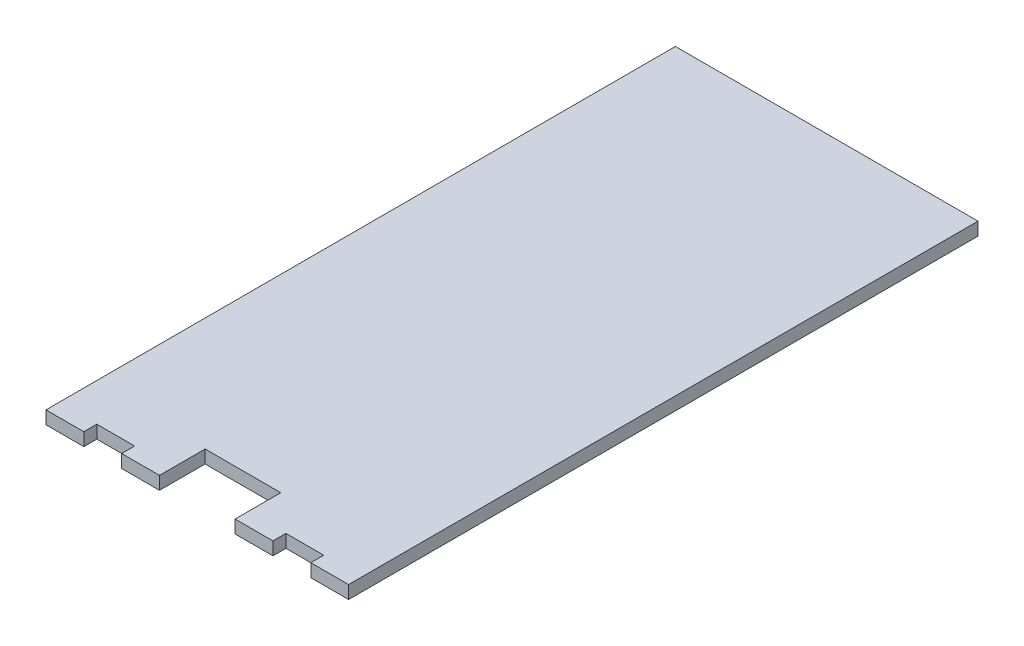
ISO-10303-21;
HEADER;
FILE_DESCRIPTION(('STEP AP214'),'2;1');
FILE_NAME('part.step','',(''),(''),'','','');
FILE_SCHEMA(('AUTOMOTIVE_DESIGN { 1 0 10303 214 1 1 1 1 }'));
ENDSEC;
DATA;
#1=APPLICATION_CONTEXT('core data for automotive mechanical design processes');
#2=APPLICATION_PROTOCOL_DEFINITION('international standard','automotive_design',2000,#1);
#3=PRODUCT_CONTEXT('',#1,'mechanical');
#4=PRODUCT('Part','Part','',(#3));
#5=PRODUCT_RELATED_PRODUCT_CATEGORY('part','',(#4));
#6=PRODUCT_DEFINITION_FORMATION('','',#4);
#7=PRODUCT_DEFINITION_CONTEXT('part definition',#1,'design');
#8=PRODUCT_DEFINITION('design','',#6,#7);
#9=PRODUCT_DEFINITION_SHAPE('','',#8);
#10=(LENGTH_UNIT() NAMED_UNIT(*) SI_UNIT(.MILLI.,.METRE.));
#11=(NAMED_UNIT(*) PLANE_ANGLE_UNIT() SI_UNIT($,.RADIAN.));
#12=(NAMED_UNIT(*) SI_UNIT($,.STERADIAN.) SOLID_ANGLE_UNIT());
#13=UNCERTAINTY_MEASURE_WITH_UNIT(LENGTH_MEASURE(1.E-05),#10,'distance_accuracy_value','');
#14=(GEOMETRIC_REPRESENTATION_CONTEXT(3) GLOBAL_UNCERTAINTY_ASSIGNED_CONTEXT((#13)) GLOBAL_UNIT_ASSIGNED_CONTEXT((#10,
#11,#12)) REPRESENTATION_CONTEXT('',''));
#15=CARTESIAN_POINT('',(0.,0.,0.));
#16=DIRECTION('',(0.,0.,1.));
#17=DIRECTION('',(1.,0.,0.));
#18=AXIS2_PLACEMENT_3D('',#15,#16,#17);
#19=CARTESIAN_POINT('',(-94.9679765258216,8.3312,360.722404882629));
#20=DIRECTION('',(0.,0.,-1.));
#21=DIRECTION('',(-1.,0.,0.));
#22=AXIS2_PLACEMENT_3D('',#19,#20,#21);
#23=PLANE('',#22);
#24=DIRECTION('',(0.,-1.,0.));
#25=VECTOR('',#24,1.);
#26=CARTESIAN_POINT('',(-46.4222265258217,8.3312,360.722404882629));
#27=LINE('',#26,#25);
#28=CARTESIAN_POINT('',(-46.4222265258217,8.3312,360.722404882629));
#29=VERTEX_POINT('',#28);
#30=CARTESIAN_POINT('',(-46.4222265258217,0.,360.722404882629));
#31=VERTEX_POINT('',#30);
#32=EDGE_CURVE('E147',#29,#31,#27,.T.);
#33=ORIENTED_EDGE('',*,*,#32,.T.);
#34=DIRECTION('',(1.,0.,0.));
#35=VECTOR('',#34,1.);
#36=CARTESIAN_POINT('',(-94.9679765258216,0.,360.722404882629));
#37=LINE('',#36,#35);
#38=CARTESIAN_POINT('',(-22.1493515258217,0.,360.722404882629));
#39=VERTEX_POINT('',#38);
#40=EDGE_CURVE('E196',#31,#39,#37,.T.);
#41=ORIENTED_EDGE('',*,*,#40,.T.);
#42=DIRECTION('',(0.,-1.,0.));
#43=VECTOR('',#42,1.);
#44=CARTESIAN_POINT('',(-22.1493515258217,8.3312,360.722404882629));
#45=LINE('',#44,#43);
#46=CARTESIAN_POINT('',(-22.1493515258217,8.3312,360.722404882629));
#47=VERTEX_POINT('',#46);
#48=EDGE_CURVE('E56',#47,#39,#45,.T.);
#49=ORIENTED_EDGE('',*,*,#48,.F.);
#50=DIRECTION('',(1.,0.,0.));
#51=VECTOR('',#50,1.);
#52=CARTESIAN_POINT('',(-94.9679765258216,8.3312,360.722404882629));
#53=LINE('',#52,#51);
#54=EDGE_CURVE('E166',#29,#47,#53,.T.);
#55=ORIENTED_EDGE('',*,*,#54,.F.);
#56=EDGE_LOOP('',(#33,#41,#49,#55));
#57=FACE_BOUND('',#56,.T.);
#58=ADVANCED_FACE('F33',(#57),#23,.F.);
#59=DIRECTION('',(0.,-1.,0.));
#60=VECTOR('',#59,1.);
#61=CARTESIAN_POINT('',(26.3963984741783,8.3312,360.722404882629));
#62=LINE('',#61,#60);
#63=CARTESIAN_POINT('',(26.3963984741783,8.3312,360.722404882629));
#64=VERTEX_POINT('',#63);
#65=CARTESIAN_POINT('',(26.3963984741783,0.,360.722404882629));
#66=VERTEX_POINT('',#65);
#67=EDGE_CURVE('E261',#64,#66,#62,.T.);
#68=ORIENTED_EDGE('',*,*,#67,.T.);
#69=CARTESIAN_POINT('',(50.6692734741782,0.,360.722404882629));
#70=VERTEX_POINT('',#69);
#71=EDGE_CURVE('E364',#66,#70,#37,.T.);
#72=ORIENTED_EDGE('',*,*,#71,.T.);
#73=DIRECTION('',(0.,-1.,0.));
#74=VECTOR('',#73,1.);
#75=CARTESIAN_POINT('',(50.6692734741783,8.3312,360.722404882629));
#76=LINE('',#75,#74);
#77=CARTESIAN_POINT('',(50.6692734741783,8.3312,360.722404882629));
#78=VERTEX_POINT('',#77);
#79=EDGE_CURVE('E48',#78,#70,#76,.T.);
#80=ORIENTED_EDGE('',*,*,#79,.F.);
#81=EDGE_CURVE('E173',#64,#78,#53,.T.);
#82=ORIENTED_EDGE('',*,*,#81,.F.);
#83=EDGE_LOOP('',(#68,#72,#80,#82));
#84=FACE_BOUND('',#83,.T.);
#85=ADVANCED_FACE('F306',(#84),#23,.F.);
#86=DIRECTION('',(0.,-1.,0.));
#87=VECTOR('',#86,1.);
#88=CARTESIAN_POINT('',(74.9421484741783,8.3312,360.722404882629));
#89=LINE('',#88,#87);
#90=CARTESIAN_POINT('',(74.9421484741783,8.3312,360.722404882629));
#91=VERTEX_POINT('',#90);
#92=CARTESIAN_POINT('',(74.9421484741783,0.,360.722404882629));
#93=VERTEX_POINT('',#92);
#94=EDGE_CURVE('E232',#91,#93,#89,.T.);
#95=ORIENTED_EDGE('',*,*,#94,.T.);
#96=CARTESIAN_POINT('',(99.2150234741784,0.,360.722404882629));
#97=VERTEX_POINT('',#96);
#98=EDGE_CURVE('E190',#93,#97,#37,.T.);
#99=ORIENTED_EDGE('',*,*,#98,.T.);
#100=DIRECTION('',(0.,-1.,0.));
#101=VECTOR('',#100,1.);
#102=CARTESIAN_POINT('',(99.2150234741784,8.3312,360.722404882629));
#103=LINE('',#102,#101);
#104=CARTESIAN_POINT('',(99.2150234741784,8.3312,360.722404882629));
#105=VERTEX_POINT('',#104);
#106=EDGE_CURVE('E41',#105,#97,#103,.T.);
#107=ORIENTED_EDGE('',*,*,#106,.F.);
#108=EDGE_CURVE('E177',#91,#105,#53,.T.);
#109=ORIENTED_EDGE('',*,*,#108,.F.);
#110=EDGE_LOOP('',(#95,#99,#107,#109));
#111=FACE_BOUND('',#110,.T.);
#112=ADVANCED_FACE('F231',(#111),#23,.F.);
#113=CARTESIAN_POINT('',(0.,8.3312,0.));
#114=DIRECTION('',(0.,1.,0.));
#115=DIRECTION('',(0.,0.,1.));
#116=AXIS2_PLACEMENT_3D('',#113,#114,#115);
#117=PLANE('',#116);
#118=DIRECTION('',(1.,0.,0.));
#119=VECTOR('',#118,1.);
#120=CARTESIAN_POINT('',(0.,8.3312,352.391204882629));
#121=LINE('',#120,#119);
#122=CARTESIAN_POINT('',(-70.6951015258217,8.3312,352.391204882629));
#123=VERTEX_POINT('',#122);
#124=CARTESIAN_POINT('',(-46.4222265258217,8.3312,352.391204882629));
#125=VERTEX_POINT('',#124);
#126=EDGE_CURVE('E159',#123,#125,#121,.T.);
#127=ORIENTED_EDGE('',*,*,#126,.T.);
#128=DIRECTION('',(0.,0.,-1.));
#129=VECTOR('',#128,1.);
#130=CARTESIAN_POINT('',(-46.4222265258217,8.3312,0.));
#131=LINE('',#130,#129);
#132=EDGE_CURVE('E150',#29,#125,#131,.T.);
#133=ORIENTED_EDGE('',*,*,#132,.F.);
#134=ORIENTED_EDGE('',*,*,#54,.T.);
#135=DIRECTION('',(0.,0.,-1.));
#136=VECTOR('',#135,1.);
#137=CARTESIAN_POINT('',(-22.1493515258217,8.3312,0.));
#138=LINE('',#137,#136);
#139=CARTESIAN_POINT('',(-22.1493515258217,8.3312,331.436204882629));
#140=VERTEX_POINT('',#139);
#141=EDGE_CURVE('E267',#47,#140,#138,.T.);
#142=ORIENTED_EDGE('',*,*,#141,.T.);
#143=DIRECTION('',(-1.,0.,0.));
#144=VECTOR('',#143,1.);
#145=CARTESIAN_POINT('',(0.,8.3312,331.436204882629));
#146=LINE('',#145,#144);
#147=CARTESIAN_POINT('',(26.3963984741783,8.3312,331.436204882629));
#148=VERTEX_POINT('',#147);
#149=EDGE_CURVE('E273',#148,#140,#146,.T.);
#150=ORIENTED_EDGE('',*,*,#149,.F.);
#151=DIRECTION('',(0.,0.,-1.));
#152=VECTOR('',#151,1.);
#153=CARTESIAN_POINT('',(26.3963984741783,8.3312,0.));
#154=LINE('',#153,#152);
#155=EDGE_CURVE('E257',#64,#148,#154,.T.);
#156=ORIENTED_EDGE('',*,*,#155,.F.);
#157=ORIENTED_EDGE('',*,*,#81,.T.);
#158=DIRECTION('',(0.,0.,-1.));
#159=VECTOR('',#158,1.);
#160=CARTESIAN_POINT('',(50.6692734741783,8.3312,0.));
#161=LINE('',#160,#159);
#162=CARTESIAN_POINT('',(50.6692734741783,8.3312,352.391204882629));
#163=VERTEX_POINT('',#162);
#164=EDGE_CURVE('E237',#78,#163,#161,.T.);
#165=ORIENTED_EDGE('',*,*,#164,.T.);
#166=DIRECTION('',(-1.,0.,0.));
#167=VECTOR('',#166,1.);
#168=CARTESIAN_POINT('',(0.,8.3312,352.391204882629));
#169=LINE('',#168,#167);
#170=CARTESIAN_POINT('',(74.9421484741783,8.3312,352.391204882629));
#171=VERTEX_POINT('',#170);
#172=EDGE_CURVE('E234',#171,#163,#169,.T.);
#173=ORIENTED_EDGE('',*,*,#172,.F.);
#174=DIRECTION('',(0.,0.,-1.));
#175=VECTOR('',#174,1.);
#176=CARTESIAN_POINT('',(74.9421484741783,8.3312,0.));
#177=LINE('',#176,#175);
#178=EDGE_CURVE('E229',#91,#171,#177,.T.);
#179=ORIENTED_EDGE('',*,*,#178,.F.);
#180=ORIENTED_EDGE('',*,*,#108,.T.);
#181=DIRECTION('',(0.,0.,-1.));
#182=VECTOR('',#181,1.);
#183=CARTESIAN_POINT('',(99.2150234741784,8.3312,-43.1680751173709));
#184=LINE('',#183,#182);
#185=CARTESIAN_POINT('',(99.2150234741784,8.3312,-43.1680751173709));
#186=VERTEX_POINT('',#185);
#187=EDGE_CURVE('E176',#105,#186,#184,.T.);
#188=ORIENTED_EDGE('',*,*,#187,.T.);
#189=DIRECTION('',(-1.,0.,0.));
#190=VECTOR('',#189,1.);
#191=CARTESIAN_POINT('',(-94.9679765258216,8.3312,-43.1680751173709));
#192=LINE('',#191,#190);
#193=CARTESIAN_POINT('',(-94.9679765258216,8.3312,-43.1680751173709));
#194=VERTEX_POINT('',#193);
#195=EDGE_CURVE('E184',#186,#194,#192,.T.);
#196=ORIENTED_EDGE('',*,*,#195,.T.);
#197=DIRECTION('',(0.,0.,1.));
#198=VECTOR('',#197,1.);
#199=CARTESIAN_POINT('',(-94.9679765258216,8.3312,-43.1680751173709));
#200=LINE('',#199,#198);
#201=CARTESIAN_POINT('',(-94.9679765258216,8.3312,360.722404882629));
#202=VERTEX_POINT('',#201);
#203=EDGE_CURVE('E181',#194,#202,#200,.T.);
#204=ORIENTED_EDGE('',*,*,#203,.T.);
#205=CARTESIAN_POINT('',(-70.6951015258217,8.3312,360.722404882629));
#206=VERTEX_POINT('',#205);
#207=EDGE_CURVE('E172',#202,#206,#53,.T.);
#208=ORIENTED_EDGE('',*,*,#207,.T.);
#209=DIRECTION('',(0.,0.,-1.));
#210=VECTOR('',#209,1.);
#211=CARTESIAN_POINT('',(-70.6951015258217,8.3312,0.));
#212=LINE('',#211,#210);
#213=EDGE_CURVE('E169',#206,#123,#212,.T.);
#214=ORIENTED_EDGE('',*,*,#213,.T.);
#215=EDGE_LOOP('',(#127,#133,#134,#142,#150,#156,#157,#165,#173,#179,#180,#188,#196,#204,#208,#214));
#216=FACE_BOUND('',#215,.T.);
#217=ADVANCED_FACE('F164',(#216),#117,.T.);
#218=CARTESIAN_POINT('',(0.,0.,0.));
#219=DIRECTION('',(0.,1.,0.));
#220=DIRECTION('',(0.,0.,1.));
#221=AXIS2_PLACEMENT_3D('',#218,#219,#220);
#222=PLANE('',#221);
#223=DIRECTION('',(0.,0.,-1.));
#224=VECTOR('',#223,1.);
#225=CARTESIAN_POINT('',(-46.4222265258217,0.,0.));
#226=LINE('',#225,#224);
#227=CARTESIAN_POINT('',(-46.4222265258217,0.,352.391204882629));
#228=VERTEX_POINT('',#227);
#229=EDGE_CURVE('E153',#31,#228,#226,.T.);
#230=ORIENTED_EDGE('',*,*,#229,.T.);
#231=DIRECTION('',(1.,0.,0.));
#232=VECTOR('',#231,1.);
#233=CARTESIAN_POINT('',(0.,0.,352.391204882629));
#234=LINE('',#233,#232);
#235=CARTESIAN_POINT('',(-70.6951015258217,0.,352.391204882629));
#236=VERTEX_POINT('',#235);
#237=EDGE_CURVE('E170',#236,#228,#234,.T.);
#238=ORIENTED_EDGE('',*,*,#237,.F.);
#239=DIRECTION('',(0.,0.,-1.));
#240=VECTOR('',#239,1.);
#241=CARTESIAN_POINT('',(-70.6951015258217,0.,0.));
#242=LINE('',#241,#240);
#243=CARTESIAN_POINT('',(-70.6951015258217,0.,360.722404882629));
#244=VERTEX_POINT('',#243);
#245=EDGE_CURVE('E282',#244,#236,#242,.T.);
#246=ORIENTED_EDGE('',*,*,#245,.F.);
#247=CARTESIAN_POINT('',(-94.9679765258216,0.,360.722404882629));
#248=VERTEX_POINT('',#247);
#249=EDGE_CURVE('E192',#248,#244,#37,.T.);
#250=ORIENTED_EDGE('',*,*,#249,.F.);
#251=DIRECTION('',(0.,0.,1.));
#252=VECTOR('',#251,1.);
#253=CARTESIAN_POINT('',(-94.9679765258216,0.,-43.1680751173709));
#254=LINE('',#253,#252);
#255=CARTESIAN_POINT('',(-94.9679765258216,0.,-43.1680751173709));
#256=VERTEX_POINT('',#255);
#257=EDGE_CURVE('E187',#256,#248,#254,.T.);
#258=ORIENTED_EDGE('',*,*,#257,.F.);
#259=DIRECTION('',(-1.,0.,0.));
#260=VECTOR('',#259,1.);
#261=CARTESIAN_POINT('',(-94.9679765258216,0.,-43.1680751173709));
#262=LINE('',#261,#260);
#263=CARTESIAN_POINT('',(99.2150234741784,0.,-43.1680751173709));
#264=VERTEX_POINT('',#263);
#265=EDGE_CURVE('E198',#264,#256,#262,.T.);
#266=ORIENTED_EDGE('',*,*,#265,.F.);
#267=DIRECTION('',(0.,0.,-1.));
#268=VECTOR('',#267,1.);
#269=CARTESIAN_POINT('',(99.2150234741784,0.,-43.1680751173709));
#270=LINE('',#269,#268);
#271=EDGE_CURVE('E195',#97,#264,#270,.T.);
#272=ORIENTED_EDGE('',*,*,#271,.F.);
#273=ORIENTED_EDGE('',*,*,#98,.F.);
#274=DIRECTION('',(0.,0.,-1.));
#275=VECTOR('',#274,1.);
#276=CARTESIAN_POINT('',(74.9421484741783,0.,0.));
#277=LINE('',#276,#275);
#278=CARTESIAN_POINT('',(74.9421484741783,0.,352.391204882629));
#279=VERTEX_POINT('',#278);
#280=EDGE_CURVE('E250',#93,#279,#277,.T.);
#281=ORIENTED_EDGE('',*,*,#280,.T.);
#282=DIRECTION('',(-1.,0.,0.));
#283=VECTOR('',#282,1.);
#284=CARTESIAN_POINT('',(0.,0.,352.391204882629));
#285=LINE('',#284,#283);
#286=CARTESIAN_POINT('',(50.6692734741783,0.,352.391204882629));
#287=VERTEX_POINT('',#286);
#288=EDGE_CURVE('E245',#279,#287,#285,.T.);
#289=ORIENTED_EDGE('',*,*,#288,.T.);
#290=DIRECTION('',(0.,0.,-1.));
#291=VECTOR('',#290,1.);
#292=CARTESIAN_POINT('',(50.6692734741783,0.,0.));
#293=LINE('',#292,#291);
#294=EDGE_CURVE('E248',#70,#287,#293,.T.);
#295=ORIENTED_EDGE('',*,*,#294,.F.);
#296=ORIENTED_EDGE('',*,*,#71,.F.);
#297=DIRECTION('',(0.,0.,-1.));
#298=VECTOR('',#297,1.);
#299=CARTESIAN_POINT('',(26.3963984741783,0.,0.));
#300=LINE('',#299,#298);
#301=CARTESIAN_POINT('',(26.3963984741783,0.,331.436204882629));
#302=VERTEX_POINT('',#301);
#303=EDGE_CURVE('E264',#66,#302,#300,.T.);
#304=ORIENTED_EDGE('',*,*,#303,.T.);
#305=DIRECTION('',(-1.,0.,0.));
#306=VECTOR('',#305,1.);
#307=CARTESIAN_POINT('',(0.,0.,331.436204882629));
#308=LINE('',#307,#306);
#309=CARTESIAN_POINT('',(-22.1493515258217,0.,331.436204882629));
#310=VERTEX_POINT('',#309);
#311=EDGE_CURVE('E268',#302,#310,#308,.T.);
#312=ORIENTED_EDGE('',*,*,#311,.T.);
#313=DIRECTION('',(0.,0.,-1.));
#314=VECTOR('',#313,1.);
#315=CARTESIAN_POINT('',(-22.1493515258217,0.,0.));
#316=LINE('',#315,#314);
#317=EDGE_CURVE('E244',#39,#310,#316,.T.);
#318=ORIENTED_EDGE('',*,*,#317,.F.);
#319=ORIENTED_EDGE('',*,*,#40,.F.);
#320=EDGE_LOOP('',(#230,#238,#246,#250,#258,#266,#272,#273,#281,#289,#295,#296,#304,#312,#318,#319));
#321=FACE_BOUND('',#320,.T.);
#322=ADVANCED_FACE('F216',(#321),#222,.F.);
#323=CARTESIAN_POINT('',(-94.9679765258216,8.3312,-43.1680751173709));
#324=DIRECTION('',(1.,0.,0.));
#325=DIRECTION('',(0.,0.,-1.));
#326=AXIS2_PLACEMENT_3D('',#323,#324,#325);
#327=PLANE('',#326);
#328=ORIENTED_EDGE('',*,*,#257,.T.);
#329=DIRECTION('',(0.,-1.,0.));
#330=VECTOR('',#329,1.);
#331=CARTESIAN_POINT('',(-94.9679765258216,8.3312,360.722404882629));
#332=LINE('',#331,#330);
#333=EDGE_CURVE('E11',#202,#248,#332,.T.);
#334=ORIENTED_EDGE('',*,*,#333,.F.);
#335=ORIENTED_EDGE('',*,*,#203,.F.);
#336=DIRECTION('',(0.,-1.,0.));
#337=VECTOR('',#336,1.);
#338=CARTESIAN_POINT('',(-94.9679765258216,8.3312,-43.1680751173709));
#339=LINE('',#338,#337);
#340=EDGE_CURVE('E186',#194,#256,#339,.T.);
#341=ORIENTED_EDGE('',*,*,#340,.T.);
#342=EDGE_LOOP('',(#328,#334,#335,#341));
#343=FACE_BOUND('',#342,.T.);
#344=ADVANCED_FACE('F35',(#343),#327,.F.);
#345=ORIENTED_EDGE('',*,*,#249,.T.);
#346=DIRECTION('',(0.,-1.,0.));
#347=VECTOR('',#346,1.);
#348=CARTESIAN_POINT('',(-70.6951015258217,8.3312,360.722404882629));
#349=LINE('',#348,#347);
#350=EDGE_CURVE('E158',#206,#244,#349,.T.);
#351=ORIENTED_EDGE('',*,*,#350,.F.);
#352=ORIENTED_EDGE('',*,*,#207,.F.);
#353=ORIENTED_EDGE('',*,*,#333,.T.);
#354=EDGE_LOOP('',(#345,#351,#352,#353));
#355=FACE_BOUND('',#354,.T.);
#356=ADVANCED_FACE('F292',(#355),#23,.F.);
#357=CARTESIAN_POINT('',(99.2150234741784,8.3312,-43.1680751173709));
#358=DIRECTION('',(-1.,0.,0.));
#359=DIRECTION('',(0.,0.,1.));
#360=AXIS2_PLACEMENT_3D('',#357,#358,#359);
#361=PLANE('',#360);
#362=ORIENTED_EDGE('',*,*,#271,.T.);
#363=DIRECTION('',(0.,-1.,0.));
#364=VECTOR('',#363,1.);
#365=CARTESIAN_POINT('',(99.2150234741784,8.3312,-43.1680751173709));
#366=LINE('',#365,#364);
#367=EDGE_CURVE('E202',#186,#264,#366,.T.);
#368=ORIENTED_EDGE('',*,*,#367,.F.);
#369=ORIENTED_EDGE('',*,*,#187,.F.);
#370=ORIENTED_EDGE('',*,*,#106,.T.);
#371=EDGE_LOOP('',(#362,#368,#369,#370));
#372=FACE_BOUND('',#371,.T.);
#373=ADVANCED_FACE('F209',(#372),#361,.F.);
#374=CARTESIAN_POINT('',(-94.9679765258216,8.3312,-43.1680751173709));
#375=DIRECTION('',(0.,0.,1.));
#376=DIRECTION('',(1.,0.,0.));
#377=AXIS2_PLACEMENT_3D('',#374,#375,#376);
#378=PLANE('',#377);
#379=ORIENTED_EDGE('',*,*,#265,.T.);
#380=ORIENTED_EDGE('',*,*,#340,.F.);
#381=ORIENTED_EDGE('',*,*,#195,.F.);
#382=ORIENTED_EDGE('',*,*,#367,.T.);
#383=EDGE_LOOP('',(#379,#380,#381,#382));
#384=FACE_BOUND('',#383,.T.);
#385=ADVANCED_FACE('F221',(#384),#378,.F.);
#386=CARTESIAN_POINT('',(74.9421484741783,8.3312,0.));
#387=DIRECTION('',(-1.,0.,0.));
#388=DIRECTION('',(0.,0.,1.));
#389=AXIS2_PLACEMENT_3D('',#386,#387,#388);
#390=PLANE('',#389);
#391=ORIENTED_EDGE('',*,*,#280,.F.);
#392=ORIENTED_EDGE('',*,*,#94,.F.);
#393=ORIENTED_EDGE('',*,*,#178,.T.);
#394=DIRECTION('',(0.,-1.,0.));
#395=VECTOR('',#394,1.);
#396=CARTESIAN_POINT('',(74.9421484741783,8.3312,352.391204882629));
#397=LINE('',#396,#395);
#398=EDGE_CURVE('E241',#171,#279,#397,.T.);
#399=ORIENTED_EDGE('',*,*,#398,.T.);
#400=EDGE_LOOP('',(#391,#392,#393,#399));
#401=FACE_BOUND('',#400,.T.);
#402=ADVANCED_FACE('F327',(#401),#390,.T.);
#403=CARTESIAN_POINT('',(0.,8.3312,352.391204882629));
#404=DIRECTION('',(0.,0.,1.));
#405=DIRECTION('',(1.,0.,0.));
#406=AXIS2_PLACEMENT_3D('',#403,#404,#405);
#407=PLANE('',#406);
#408=ORIENTED_EDGE('',*,*,#288,.F.);
#409=ORIENTED_EDGE('',*,*,#398,.F.);
#410=ORIENTED_EDGE('',*,*,#172,.T.);
#411=DIRECTION('',(0.,-1.,0.));
#412=VECTOR('',#411,1.);
#413=CARTESIAN_POINT('',(50.6692734741783,8.3312,352.391204882629));
#414=LINE('',#413,#412);
#415=EDGE_CURVE('E235',#163,#287,#414,.T.);
#416=ORIENTED_EDGE('',*,*,#415,.T.);
#417=EDGE_LOOP('',(#408,#409,#410,#416));
#418=FACE_BOUND('',#417,.T.);
#419=ADVANCED_FACE('F334',(#418),#407,.T.);
#420=CARTESIAN_POINT('',(50.6692734741783,8.3312,0.));
#421=DIRECTION('',(-1.,0.,0.));
#422=DIRECTION('',(0.,0.,1.));
#423=AXIS2_PLACEMENT_3D('',#420,#421,#422);
#424=PLANE('',#423);
#425=ORIENTED_EDGE('',*,*,#294,.T.);
#426=ORIENTED_EDGE('',*,*,#415,.F.);
#427=ORIENTED_EDGE('',*,*,#164,.F.);
#428=ORIENTED_EDGE('',*,*,#79,.T.);
#429=EDGE_LOOP('',(#425,#426,#427,#428));
#430=FACE_BOUND('',#429,.T.);
#431=ADVANCED_FACE('F338',(#430),#424,.F.);
#432=CARTESIAN_POINT('',(26.3963984741783,8.3312,0.));
#433=DIRECTION('',(-1.,0.,0.));
#434=DIRECTION('',(0.,0.,1.));
#435=AXIS2_PLACEMENT_3D('',#432,#433,#434);
#436=PLANE('',#435);
#437=ORIENTED_EDGE('',*,*,#303,.F.);
#438=ORIENTED_EDGE('',*,*,#67,.F.);
#439=ORIENTED_EDGE('',*,*,#155,.T.);
#440=DIRECTION('',(0.,-1.,0.));
#441=VECTOR('',#440,1.);
#442=CARTESIAN_POINT('',(26.3963984741783,8.3312,331.436204882629));
#443=LINE('',#442,#441);
#444=EDGE_CURVE('E259',#148,#302,#443,.T.);
#445=ORIENTED_EDGE('',*,*,#444,.T.);
#446=EDGE_LOOP('',(#437,#438,#439,#445));
#447=FACE_BOUND('',#446,.T.);
#448=ADVANCED_FACE('F346',(#447),#436,.T.);
#449=CARTESIAN_POINT('',(0.,8.3312,331.436204882629));
#450=DIRECTION('',(0.,0.,1.));
#451=DIRECTION('',(1.,0.,0.));
#452=AXIS2_PLACEMENT_3D('',#449,#450,#451);
#453=PLANE('',#452);
#454=ORIENTED_EDGE('',*,*,#311,.F.);
#455=ORIENTED_EDGE('',*,*,#444,.F.);
#456=ORIENTED_EDGE('',*,*,#149,.T.);
#457=DIRECTION('',(0.,-1.,0.));
#458=VECTOR('',#457,1.);
#459=CARTESIAN_POINT('',(-22.1493515258217,8.3312,331.436204882629));
#460=LINE('',#459,#458);
#461=EDGE_CURVE('E256',#140,#310,#460,.T.);
#462=ORIENTED_EDGE('',*,*,#461,.T.);
#463=EDGE_LOOP('',(#454,#455,#456,#462));
#464=FACE_BOUND('',#463,.T.);
#465=ADVANCED_FACE('F350',(#464),#453,.T.);
#466=CARTESIAN_POINT('',(-22.1493515258217,8.3312,0.));
#467=DIRECTION('',(-1.,0.,0.));
#468=DIRECTION('',(0.,0.,1.));
#469=AXIS2_PLACEMENT_3D('',#466,#467,#468);
#470=PLANE('',#469);
#471=ORIENTED_EDGE('',*,*,#317,.T.);
#472=ORIENTED_EDGE('',*,*,#461,.F.);
#473=ORIENTED_EDGE('',*,*,#141,.F.);
#474=ORIENTED_EDGE('',*,*,#48,.T.);
#475=EDGE_LOOP('',(#471,#472,#473,#474));
#476=FACE_BOUND('',#475,.T.);
#477=ADVANCED_FACE('F303',(#476),#470,.F.);
#478=CARTESIAN_POINT('',(-46.4222265258217,8.3312,0.));
#479=DIRECTION('',(-1.,0.,0.));
#480=DIRECTION('',(0.,0.,1.));
#481=AXIS2_PLACEMENT_3D('',#478,#479,#480);
#482=PLANE('',#481);
#483=ORIENTED_EDGE('',*,*,#229,.F.);
#484=ORIENTED_EDGE('',*,*,#32,.F.);
#485=ORIENTED_EDGE('',*,*,#132,.T.);
#486=DIRECTION('',(0.,-1.,0.));
#487=VECTOR('',#486,1.);
#488=CARTESIAN_POINT('',(-46.4222265258217,8.3312,352.391204882629));
#489=LINE('',#488,#487);
#490=EDGE_CURVE('E191',#125,#228,#489,.T.);
#491=ORIENTED_EDGE('',*,*,#490,.T.);
#492=EDGE_LOOP('',(#483,#484,#485,#491));
#493=FACE_BOUND('',#492,.T.);
#494=ADVANCED_FACE('F149',(#493),#482,.T.);
#495=CARTESIAN_POINT('',(0.,8.3312,352.391204882629));
#496=DIRECTION('',(0.,0.,-1.));
#497=DIRECTION('',(-1.,0.,0.));
#498=AXIS2_PLACEMENT_3D('',#495,#496,#497);
#499=PLANE('',#498);
#500=ORIENTED_EDGE('',*,*,#237,.T.);
#501=ORIENTED_EDGE('',*,*,#490,.F.);
#502=ORIENTED_EDGE('',*,*,#126,.F.);
#503=DIRECTION('',(0.,-1.,0.));
#504=VECTOR('',#503,1.);
#505=CARTESIAN_POINT('',(-70.6951015258217,8.3312,352.391204882629));
#506=LINE('',#505,#504);
#507=EDGE_CURVE('E277',#123,#236,#506,.T.);
#508=ORIENTED_EDGE('',*,*,#507,.T.);
#509=EDGE_LOOP('',(#500,#501,#502,#508));
#510=FACE_BOUND('',#509,.T.);
#511=ADVANCED_FACE('F295',(#510),#499,.F.);
#512=CARTESIAN_POINT('',(-70.6951015258217,8.3312,0.));
#513=DIRECTION('',(-1.,0.,0.));
#514=DIRECTION('',(0.,0.,1.));
#515=AXIS2_PLACEMENT_3D('',#512,#513,#514);
#516=PLANE('',#515);
#517=ORIENTED_EDGE('',*,*,#245,.T.);
#518=ORIENTED_EDGE('',*,*,#507,.F.);
#519=ORIENTED_EDGE('',*,*,#213,.F.);
#520=ORIENTED_EDGE('',*,*,#350,.T.);
#521=EDGE_LOOP('',(#517,#518,#519,#520));
#522=FACE_BOUND('',#521,.T.);
#523=ADVANCED_FACE('F289',(#522),#516,.F.);
#524=CLOSED_SHELL('',(#58,#85,#112,#217,#322,#344,#356,#373,#385,#402,#419,#431,#448,#465,#477,
#494,#511,#523));
#525=MANIFOLD_SOLID_BREP('B2',#524);
#526=ADVANCED_BREP_SHAPE_REPRESENTATION('',(#18,#525),#14);
#527=SHAPE_DEFINITION_REPRESENTATION(#9,#526);
ENDSEC;
END-ISO-10303-21;
